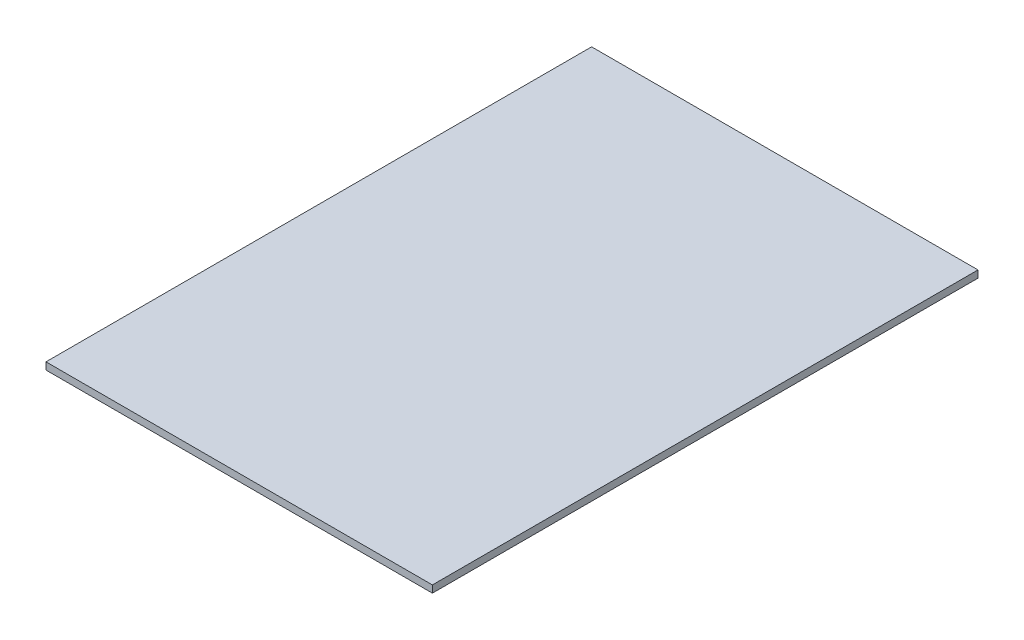
ISO-10303-21;
HEADER;
FILE_DESCRIPTION(('STEP AP214'),'2;1');
FILE_NAME('part.step','',(''),(''),'','','');
FILE_SCHEMA(('AUTOMOTIVE_DESIGN { 1 0 10303 214 1 1 1 1 }'));
ENDSEC;
DATA;
#1=APPLICATION_CONTEXT('core data for automotive mechanical design processes');
#2=APPLICATION_PROTOCOL_DEFINITION('international standard','automotive_design',2000,#1);
#3=PRODUCT_CONTEXT('',#1,'mechanical');
#4=PRODUCT('Part','Part','',(#3));
#5=PRODUCT_RELATED_PRODUCT_CATEGORY('part','',(#4));
#6=PRODUCT_DEFINITION_FORMATION('','',#4);
#7=PRODUCT_DEFINITION_CONTEXT('part definition',#1,'design');
#8=PRODUCT_DEFINITION('design','',#6,#7);
#9=PRODUCT_DEFINITION_SHAPE('','',#8);
#10=(LENGTH_UNIT() NAMED_UNIT(*) SI_UNIT(.MILLI.,.METRE.));
#11=(NAMED_UNIT(*) PLANE_ANGLE_UNIT() SI_UNIT($,.RADIAN.));
#12=(NAMED_UNIT(*) SI_UNIT($,.STERADIAN.) SOLID_ANGLE_UNIT());
#13=UNCERTAINTY_MEASURE_WITH_UNIT(LENGTH_MEASURE(1.E-05),#10,'distance_accuracy_value','');
#14=(GEOMETRIC_REPRESENTATION_CONTEXT(3) GLOBAL_UNCERTAINTY_ASSIGNED_CONTEXT((#13)) GLOBAL_UNIT_ASSIGNED_CONTEXT((#10,
#11,#12)) REPRESENTATION_CONTEXT('',''));
#15=CARTESIAN_POINT('',(0.,0.,0.));
#16=DIRECTION('',(0.,0.,1.));
#17=DIRECTION('',(1.,0.,0.));
#18=AXIS2_PLACEMENT_3D('',#15,#16,#17);
#19=CARTESIAN_POINT('',(-108.,4.,-155.));
#20=DIRECTION('',(1.,0.,0.));
#21=DIRECTION('',(0.,0.,-1.));
#22=AXIS2_PLACEMENT_3D('',#19,#20,#21);
#23=PLANE('',#22);
#24=DIRECTION('',(0.,0.,1.));
#25=VECTOR('',#24,1.);
#26=CARTESIAN_POINT('',(-108.,4.,-155.));
#27=LINE('',#26,#25);
#28=CARTESIAN_POINT('',(-108.,4.,-152.5));
#29=VERTEX_POINT('',#28);
#30=CARTESIAN_POINT('',(-108.,4.,152.5));
#31=VERTEX_POINT('',#30);
#32=EDGE_CURVE('E47',#29,#31,#27,.T.);
#33=ORIENTED_EDGE('',*,*,#32,.F.);
#34=DIRECTION('',(0.,1.,0.));
#35=VECTOR('',#34,1.);
#36=CARTESIAN_POINT('',(-108.,0.,-152.5));
#37=LINE('',#36,#35);
#38=CARTESIAN_POINT('',(-108.,0.,-152.5));
#39=VERTEX_POINT('',#38);
#40=EDGE_CURVE('E79',#39,#29,#37,.T.);
#41=ORIENTED_EDGE('',*,*,#40,.F.);
#42=DIRECTION('',(0.,0.,1.));
#43=VECTOR('',#42,1.);
#44=CARTESIAN_POINT('',(-108.,0.,-155.));
#45=LINE('',#44,#43);
#46=CARTESIAN_POINT('',(-108.,0.,152.5));
#47=VERTEX_POINT('',#46);
#48=EDGE_CURVE('E98',#39,#47,#45,.T.);
#49=ORIENTED_EDGE('',*,*,#48,.T.);
#50=DIRECTION('',(0.,1.,0.));
#51=VECTOR('',#50,1.);
#52=CARTESIAN_POINT('',(-108.,0.,152.5));
#53=LINE('',#52,#51);
#54=EDGE_CURVE('E63',#47,#31,#53,.T.);
#55=ORIENTED_EDGE('',*,*,#54,.T.);
#56=EDGE_LOOP('',(#33,#41,#49,#55));
#57=FACE_BOUND('',#56,.T.);
#58=ADVANCED_FACE('F39',(#57),#23,.F.);
#59=CARTESIAN_POINT('',(108.,4.,-155.));
#60=DIRECTION('',(-1.,0.,0.));
#61=DIRECTION('',(0.,0.,1.));
#62=AXIS2_PLACEMENT_3D('',#59,#60,#61);
#63=PLANE('',#62);
#64=DIRECTION('',(0.,0.,-1.));
#65=VECTOR('',#64,1.);
#66=CARTESIAN_POINT('',(108.,0.,-155.));
#67=LINE('',#66,#65);
#68=CARTESIAN_POINT('',(108.,0.,152.5));
#69=VERTEX_POINT('',#68);
#70=CARTESIAN_POINT('',(108.,0.,-152.5));
#71=VERTEX_POINT('',#70);
#72=EDGE_CURVE('E42',#69,#71,#67,.T.);
#73=ORIENTED_EDGE('',*,*,#72,.T.);
#74=DIRECTION('',(0.,1.,0.));
#75=VECTOR('',#74,1.);
#76=CARTESIAN_POINT('',(108.,0.,-152.5));
#77=LINE('',#76,#75);
#78=CARTESIAN_POINT('',(108.,4.,-152.5));
#79=VERTEX_POINT('',#78);
#80=EDGE_CURVE('E55',#71,#79,#77,.T.);
#81=ORIENTED_EDGE('',*,*,#80,.T.);
#82=DIRECTION('',(0.,0.,-1.));
#83=VECTOR('',#82,1.);
#84=CARTESIAN_POINT('',(108.,4.,-155.));
#85=LINE('',#84,#83);
#86=CARTESIAN_POINT('',(108.,4.,152.5));
#87=VERTEX_POINT('',#86);
#88=EDGE_CURVE('E11',#87,#79,#85,.T.);
#89=ORIENTED_EDGE('',*,*,#88,.F.);
#90=DIRECTION('',(0.,1.,0.));
#91=VECTOR('',#90,1.);
#92=CARTESIAN_POINT('',(108.,0.,152.5));
#93=LINE('',#92,#91);
#94=EDGE_CURVE('E106',#69,#87,#93,.T.);
#95=ORIENTED_EDGE('',*,*,#94,.F.);
#96=EDGE_LOOP('',(#73,#81,#89,#95));
#97=FACE_BOUND('',#96,.T.);
#98=ADVANCED_FACE('F113',(#97),#63,.F.);
#99=CARTESIAN_POINT('',(0.,4.,0.));
#100=DIRECTION('',(0.,-1.,0.));
#101=DIRECTION('',(0.,0.,-1.));
#102=AXIS2_PLACEMENT_3D('',#99,#100,#101);
#103=PLANE('',#102);
#104=ORIENTED_EDGE('',*,*,#88,.T.);
#105=DIRECTION('',(1.,0.,0.));
#106=VECTOR('',#105,1.);
#107=CARTESIAN_POINT('',(-108.,4.,-152.5));
#108=LINE('',#107,#106);
#109=EDGE_CURVE('E82',#29,#79,#108,.T.);
#110=ORIENTED_EDGE('',*,*,#109,.F.);
#111=ORIENTED_EDGE('',*,*,#32,.T.);
#112=DIRECTION('',(-1.,0.,0.));
#113=VECTOR('',#112,1.);
#114=CARTESIAN_POINT('',(-108.,4.,152.5));
#115=LINE('',#114,#113);
#116=EDGE_CURVE('E94',#87,#31,#115,.T.);
#117=ORIENTED_EDGE('',*,*,#116,.F.);
#118=EDGE_LOOP('',(#104,#110,#111,#117));
#119=FACE_BOUND('',#118,.T.);
#120=ADVANCED_FACE('F91',(#119),#103,.F.);
#121=CARTESIAN_POINT('',(0.,0.,0.));
#122=DIRECTION('',(0.,-1.,0.));
#123=DIRECTION('',(0.,0.,-1.));
#124=AXIS2_PLACEMENT_3D('',#121,#122,#123);
#125=PLANE('',#124);
#126=DIRECTION('',(1.,0.,0.));
#127=VECTOR('',#126,1.);
#128=CARTESIAN_POINT('',(-108.,0.,-152.5));
#129=LINE('',#128,#127);
#130=EDGE_CURVE('E83',#39,#71,#129,.T.);
#131=ORIENTED_EDGE('',*,*,#130,.T.);
#132=ORIENTED_EDGE('',*,*,#72,.F.);
#133=DIRECTION('',(-1.,0.,0.));
#134=VECTOR('',#133,1.);
#135=CARTESIAN_POINT('',(-108.,0.,152.5));
#136=LINE('',#135,#134);
#137=EDGE_CURVE('E100',#69,#47,#136,.T.);
#138=ORIENTED_EDGE('',*,*,#137,.T.);
#139=ORIENTED_EDGE('',*,*,#48,.F.);
#140=EDGE_LOOP('',(#131,#132,#138,#139));
#141=FACE_BOUND('',#140,.T.);
#142=ADVANCED_FACE('F110',(#141),#125,.T.);
#143=CARTESIAN_POINT('',(-108.,0.,152.5));
#144=DIRECTION('',(0.,0.,-1.));
#145=DIRECTION('',(-1.,0.,0.));
#146=AXIS2_PLACEMENT_3D('',#143,#144,#145);
#147=PLANE('',#146);
#148=ORIENTED_EDGE('',*,*,#116,.T.);
#149=ORIENTED_EDGE('',*,*,#54,.F.);
#150=ORIENTED_EDGE('',*,*,#137,.F.);
#151=ORIENTED_EDGE('',*,*,#94,.T.);
#152=EDGE_LOOP('',(#148,#149,#150,#151));
#153=FACE_BOUND('',#152,.T.);
#154=ADVANCED_FACE('F112',(#153),#147,.F.);
#155=CARTESIAN_POINT('',(-108.,0.,-152.5));
#156=DIRECTION('',(0.,0.,1.));
#157=DIRECTION('',(1.,0.,0.));
#158=AXIS2_PLACEMENT_3D('',#155,#156,#157);
#159=PLANE('',#158);
#160=ORIENTED_EDGE('',*,*,#109,.T.);
#161=ORIENTED_EDGE('',*,*,#80,.F.);
#162=ORIENTED_EDGE('',*,*,#130,.F.);
#163=ORIENTED_EDGE('',*,*,#40,.T.);
#164=EDGE_LOOP('',(#160,#161,#162,#163));
#165=FACE_BOUND('',#164,.T.);
#166=ADVANCED_FACE('F81',(#165),#159,.F.);
#167=CLOSED_SHELL('',(#58,#98,#120,#142,#154,#166));
#168=MANIFOLD_SOLID_BREP('B2',#167);
#169=ADVANCED_BREP_SHAPE_REPRESENTATION('',(#18,#168),#14);
#170=SHAPE_DEFINITION_REPRESENTATION(#9,#169);
ENDSEC;
END-ISO-10303-21;
